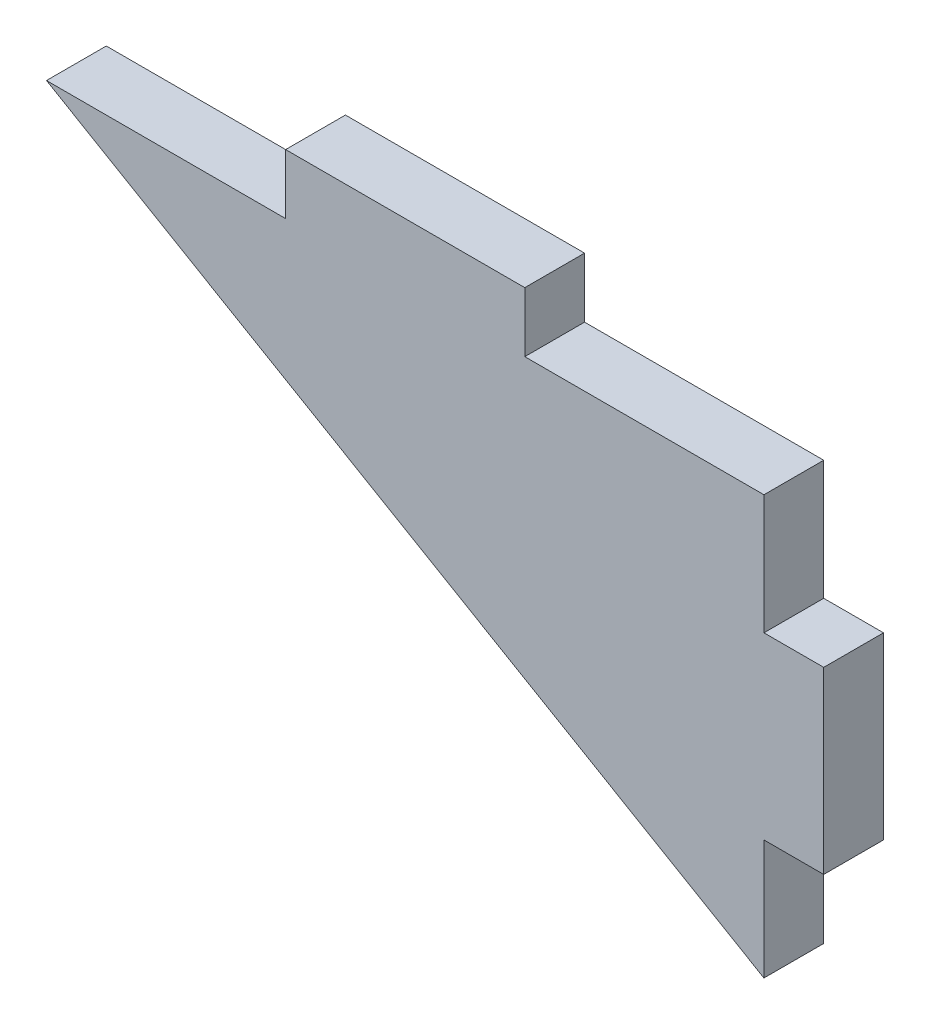
ISO-10303-21;
HEADER;
FILE_DESCRIPTION(('STEP AP214'),'2;1');
FILE_NAME('part.step','',(''),(''),'','','');
FILE_SCHEMA(('AUTOMOTIVE_DESIGN { 1 0 10303 214 1 1 1 1 }'));
ENDSEC;
DATA;
#1=APPLICATION_CONTEXT('core data for automotive mechanical design processes');
#2=APPLICATION_PROTOCOL_DEFINITION('international standard','automotive_design',2000,#1);
#3=PRODUCT_CONTEXT('',#1,'mechanical');
#4=PRODUCT('Part','Part','',(#3));
#5=PRODUCT_RELATED_PRODUCT_CATEGORY('part','',(#4));
#6=PRODUCT_DEFINITION_FORMATION('','',#4);
#7=PRODUCT_DEFINITION_CONTEXT('part definition',#1,'design');
#8=PRODUCT_DEFINITION('design','',#6,#7);
#9=PRODUCT_DEFINITION_SHAPE('','',#8);
#10=(LENGTH_UNIT() NAMED_UNIT(*) SI_UNIT(.MILLI.,.METRE.));
#11=(NAMED_UNIT(*) PLANE_ANGLE_UNIT() SI_UNIT($,.RADIAN.));
#12=(NAMED_UNIT(*) SI_UNIT($,.STERADIAN.) SOLID_ANGLE_UNIT());
#13=UNCERTAINTY_MEASURE_WITH_UNIT(LENGTH_MEASURE(1.E-05),#10,'distance_accuracy_value','');
#14=(GEOMETRIC_REPRESENTATION_CONTEXT(3) GLOBAL_UNCERTAINTY_ASSIGNED_CONTEXT((#13)) GLOBAL_UNIT_ASSIGNED_CONTEXT((#10,
#11,#12)) REPRESENTATION_CONTEXT('',''));
#15=CARTESIAN_POINT('',(0.,0.,0.));
#16=DIRECTION('',(0.,0.,1.));
#17=DIRECTION('',(1.,0.,0.));
#18=AXIS2_PLACEMENT_3D('',#15,#16,#17);
#19=CARTESIAN_POINT('',(-60.,35.,5.));
#20=DIRECTION('',(0.503871025524086,0.863778900898433,0.));
#21=DIRECTION('',(-0.863778900898433,0.503871025524086,0.));
#22=AXIS2_PLACEMENT_3D('',#19,#20,#21);
#23=PLANE('',#22);
#24=DIRECTION('',(0.863778900898433,-0.503871025524086,0.));
#25=VECTOR('',#24,1.);
#26=CARTESIAN_POINT('',(-60.,35.,0.));
#27=LINE('',#26,#25);
#28=CARTESIAN_POINT('',(-60.,35.,0.));
#29=VERTEX_POINT('',#28);
#30=CARTESIAN_POINT('',(0.,0.,0.));
#31=VERTEX_POINT('',#30);
#32=EDGE_CURVE('E151',#29,#31,#27,.T.);
#33=ORIENTED_EDGE('',*,*,#32,.T.);
#34=DIRECTION('',(0.,0.,-1.));
#35=VECTOR('',#34,1.);
#36=CARTESIAN_POINT('',(0.,0.,5.));
#37=LINE('',#36,#35);
#38=CARTESIAN_POINT('',(0.,0.,5.));
#39=VERTEX_POINT('',#38);
#40=EDGE_CURVE('E11',#39,#31,#37,.T.);
#41=ORIENTED_EDGE('',*,*,#40,.F.);
#42=DIRECTION('',(0.863778900898433,-0.503871025524086,0.));
#43=VECTOR('',#42,1.);
#44=CARTESIAN_POINT('',(-60.,35.,5.));
#45=LINE('',#44,#43);
#46=CARTESIAN_POINT('',(-60.,35.,5.));
#47=VERTEX_POINT('',#46);
#48=EDGE_CURVE('E171',#47,#39,#45,.T.);
#49=ORIENTED_EDGE('',*,*,#48,.F.);
#50=DIRECTION('',(0.,0.,-1.));
#51=VECTOR('',#50,1.);
#52=CARTESIAN_POINT('',(-60.,35.,5.));
#53=LINE('',#52,#51);
#54=EDGE_CURVE('E147',#47,#29,#53,.T.);
#55=ORIENTED_EDGE('',*,*,#54,.T.);
#56=EDGE_LOOP('',(#33,#41,#49,#55));
#57=FACE_BOUND('',#56,.T.);
#58=ADVANCED_FACE('F37',(#57),#23,.F.);
#59=CARTESIAN_POINT('',(0.,0.,5.));
#60=DIRECTION('',(-1.,0.,0.));
#61=DIRECTION('',(0.,0.,1.));
#62=AXIS2_PLACEMENT_3D('',#59,#60,#61);
#63=PLANE('',#62);
#64=DIRECTION('',(0.,1.,0.));
#65=VECTOR('',#64,1.);
#66=CARTESIAN_POINT('',(0.,0.,0.));
#67=LINE('',#66,#65);
#68=CARTESIAN_POINT('',(0.,10.,0.));
#69=VERTEX_POINT('',#68);
#70=EDGE_CURVE('E154',#31,#69,#67,.T.);
#71=ORIENTED_EDGE('',*,*,#70,.T.);
#72=DIRECTION('',(0.,0.,-1.));
#73=VECTOR('',#72,1.);
#74=CARTESIAN_POINT('',(0.,10.,5.));
#75=LINE('',#74,#73);
#76=CARTESIAN_POINT('',(0.,10.,5.));
#77=VERTEX_POINT('',#76);
#78=EDGE_CURVE('E45',#77,#69,#75,.T.);
#79=ORIENTED_EDGE('',*,*,#78,.F.);
#80=DIRECTION('',(0.,1.,0.));
#81=VECTOR('',#80,1.);
#82=CARTESIAN_POINT('',(0.,0.,5.));
#83=LINE('',#82,#81);
#84=EDGE_CURVE('E105',#39,#77,#83,.T.);
#85=ORIENTED_EDGE('',*,*,#84,.F.);
#86=ORIENTED_EDGE('',*,*,#40,.T.);
#87=EDGE_LOOP('',(#71,#79,#85,#86));
#88=FACE_BOUND('',#87,.T.);
#89=ADVANCED_FACE('F243',(#88),#63,.F.);
#90=CARTESIAN_POINT('',(0.,10.,5.));
#91=DIRECTION('',(0.,1.,0.));
#92=DIRECTION('',(0.,0.,1.));
#93=AXIS2_PLACEMENT_3D('',#90,#91,#92);
#94=PLANE('',#93);
#95=DIRECTION('',(1.,0.,0.));
#96=VECTOR('',#95,1.);
#97=CARTESIAN_POINT('',(0.,10.,0.));
#98=LINE('',#97,#96);
#99=CARTESIAN_POINT('',(5.,10.,0.));
#100=VERTEX_POINT('',#99);
#101=EDGE_CURVE('E156',#69,#100,#98,.T.);
#102=ORIENTED_EDGE('',*,*,#101,.T.);
#103=DIRECTION('',(0.,0.,-1.));
#104=VECTOR('',#103,1.);
#105=CARTESIAN_POINT('',(5.,10.,5.));
#106=LINE('',#105,#104);
#107=CARTESIAN_POINT('',(5.,10.,5.));
#108=VERTEX_POINT('',#107);
#109=EDGE_CURVE('E187',#108,#100,#106,.T.);
#110=ORIENTED_EDGE('',*,*,#109,.F.);
#111=DIRECTION('',(1.,0.,0.));
#112=VECTOR('',#111,1.);
#113=CARTESIAN_POINT('',(0.,10.,5.));
#114=LINE('',#113,#112);
#115=EDGE_CURVE('E195',#77,#108,#114,.T.);
#116=ORIENTED_EDGE('',*,*,#115,.F.);
#117=ORIENTED_EDGE('',*,*,#78,.T.);
#118=EDGE_LOOP('',(#102,#110,#116,#117));
#119=FACE_BOUND('',#118,.T.);
#120=ADVANCED_FACE('F193',(#119),#94,.F.);
#121=CARTESIAN_POINT('',(5.,10.,5.));
#122=DIRECTION('',(-1.,0.,0.));
#123=DIRECTION('',(0.,0.,1.));
#124=AXIS2_PLACEMENT_3D('',#121,#122,#123);
#125=PLANE('',#124);
#126=DIRECTION('',(0.,1.,0.));
#127=VECTOR('',#126,1.);
#128=CARTESIAN_POINT('',(5.,10.,0.));
#129=LINE('',#128,#127);
#130=CARTESIAN_POINT('',(5.,25.,0.));
#131=VERTEX_POINT('',#130);
#132=EDGE_CURVE('E158',#100,#131,#129,.T.);
#133=ORIENTED_EDGE('',*,*,#132,.T.);
#134=DIRECTION('',(0.,0.,-1.));
#135=VECTOR('',#134,1.);
#136=CARTESIAN_POINT('',(5.,25.,5.));
#137=LINE('',#136,#135);
#138=CARTESIAN_POINT('',(5.,25.,5.));
#139=VERTEX_POINT('',#138);
#140=EDGE_CURVE('E184',#139,#131,#137,.T.);
#141=ORIENTED_EDGE('',*,*,#140,.F.);
#142=DIRECTION('',(0.,1.,0.));
#143=VECTOR('',#142,1.);
#144=CARTESIAN_POINT('',(5.,10.,5.));
#145=LINE('',#144,#143);
#146=EDGE_CURVE('E213',#108,#139,#145,.T.);
#147=ORIENTED_EDGE('',*,*,#146,.F.);
#148=ORIENTED_EDGE('',*,*,#109,.T.);
#149=EDGE_LOOP('',(#133,#141,#147,#148));
#150=FACE_BOUND('',#149,.T.);
#151=ADVANCED_FACE('F204',(#150),#125,.F.);
#152=CARTESIAN_POINT('',(5.,25.,5.));
#153=DIRECTION('',(0.,-1.,0.));
#154=DIRECTION('',(0.,0.,-1.));
#155=AXIS2_PLACEMENT_3D('',#152,#153,#154);
#156=PLANE('',#155);
#157=DIRECTION('',(-1.,0.,0.));
#158=VECTOR('',#157,1.);
#159=CARTESIAN_POINT('',(5.,25.,0.));
#160=LINE('',#159,#158);
#161=CARTESIAN_POINT('',(0.,25.,0.));
#162=VERTEX_POINT('',#161);
#163=EDGE_CURVE('E160',#131,#162,#160,.T.);
#164=ORIENTED_EDGE('',*,*,#163,.T.);
#165=DIRECTION('',(0.,0.,-1.));
#166=VECTOR('',#165,1.);
#167=CARTESIAN_POINT('',(0.,25.,5.));
#168=LINE('',#167,#166);
#169=CARTESIAN_POINT('',(0.,25.,5.));
#170=VERTEX_POINT('',#169);
#171=EDGE_CURVE('E181',#170,#162,#168,.T.);
#172=ORIENTED_EDGE('',*,*,#171,.F.);
#173=DIRECTION('',(-1.,0.,0.));
#174=VECTOR('',#173,1.);
#175=CARTESIAN_POINT('',(5.,25.,5.));
#176=LINE('',#175,#174);
#177=EDGE_CURVE('E210',#139,#170,#176,.T.);
#178=ORIENTED_EDGE('',*,*,#177,.F.);
#179=ORIENTED_EDGE('',*,*,#140,.T.);
#180=EDGE_LOOP('',(#164,#172,#178,#179));
#181=FACE_BOUND('',#180,.T.);
#182=ADVANCED_FACE('F208',(#181),#156,.F.);
#183=CARTESIAN_POINT('',(0.,25.,5.));
#184=DIRECTION('',(-1.,0.,0.));
#185=DIRECTION('',(0.,0.,1.));
#186=AXIS2_PLACEMENT_3D('',#183,#184,#185);
#187=PLANE('',#186);
#188=DIRECTION('',(0.,1.,0.));
#189=VECTOR('',#188,1.);
#190=CARTESIAN_POINT('',(0.,25.,0.));
#191=LINE('',#190,#189);
#192=CARTESIAN_POINT('',(0.,35.,0.));
#193=VERTEX_POINT('',#192);
#194=EDGE_CURVE('E162',#162,#193,#191,.T.);
#195=ORIENTED_EDGE('',*,*,#194,.T.);
#196=DIRECTION('',(0.,0.,-1.));
#197=VECTOR('',#196,1.);
#198=CARTESIAN_POINT('',(0.,35.,5.));
#199=LINE('',#198,#197);
#200=CARTESIAN_POINT('',(0.,35.,5.));
#201=VERTEX_POINT('',#200);
#202=EDGE_CURVE('E178',#201,#193,#199,.T.);
#203=ORIENTED_EDGE('',*,*,#202,.F.);
#204=DIRECTION('',(0.,1.,0.));
#205=VECTOR('',#204,1.);
#206=CARTESIAN_POINT('',(0.,25.,5.));
#207=LINE('',#206,#205);
#208=EDGE_CURVE('E212',#170,#201,#207,.T.);
#209=ORIENTED_EDGE('',*,*,#208,.F.);
#210=ORIENTED_EDGE('',*,*,#171,.T.);
#211=EDGE_LOOP('',(#195,#203,#209,#210));
#212=FACE_BOUND('',#211,.T.);
#213=ADVANCED_FACE('F256',(#212),#187,.F.);
#214=CARTESIAN_POINT('',(0.,35.,5.));
#215=DIRECTION('',(0.,-1.,0.));
#216=DIRECTION('',(0.,0.,-1.));
#217=AXIS2_PLACEMENT_3D('',#214,#215,#216);
#218=PLANE('',#217);
#219=DIRECTION('',(-1.,0.,0.));
#220=VECTOR('',#219,1.);
#221=CARTESIAN_POINT('',(0.,35.,0.));
#222=LINE('',#221,#220);
#223=CARTESIAN_POINT('',(-20.,35.,0.));
#224=VERTEX_POINT('',#223);
#225=EDGE_CURVE('E164',#193,#224,#222,.T.);
#226=ORIENTED_EDGE('',*,*,#225,.T.);
#227=DIRECTION('',(0.,0.,-1.));
#228=VECTOR('',#227,1.);
#229=CARTESIAN_POINT('',(-20.,35.,5.));
#230=LINE('',#229,#228);
#231=CARTESIAN_POINT('',(-20.,35.,5.));
#232=VERTEX_POINT('',#231);
#233=EDGE_CURVE('E175',#232,#224,#230,.T.);
#234=ORIENTED_EDGE('',*,*,#233,.F.);
#235=DIRECTION('',(-1.,0.,0.));
#236=VECTOR('',#235,1.);
#237=CARTESIAN_POINT('',(0.,35.,5.));
#238=LINE('',#237,#236);
#239=EDGE_CURVE('E215',#201,#232,#238,.T.);
#240=ORIENTED_EDGE('',*,*,#239,.F.);
#241=ORIENTED_EDGE('',*,*,#202,.T.);
#242=EDGE_LOOP('',(#226,#234,#240,#241));
#243=FACE_BOUND('',#242,.T.);
#244=ADVANCED_FACE('F224',(#243),#218,.F.);
#245=CARTESIAN_POINT('',(-20.,35.,5.));
#246=DIRECTION('',(-1.,0.,0.));
#247=DIRECTION('',(0.,0.,1.));
#248=AXIS2_PLACEMENT_3D('',#245,#246,#247);
#249=PLANE('',#248);
#250=DIRECTION('',(0.,1.,0.));
#251=VECTOR('',#250,1.);
#252=CARTESIAN_POINT('',(-20.,35.,0.));
#253=LINE('',#252,#251);
#254=CARTESIAN_POINT('',(-20.,40.,0.));
#255=VERTEX_POINT('',#254);
#256=EDGE_CURVE('E166',#224,#255,#253,.T.);
#257=ORIENTED_EDGE('',*,*,#256,.T.);
#258=DIRECTION('',(0.,0.,-1.));
#259=VECTOR('',#258,1.);
#260=CARTESIAN_POINT('',(-20.,40.,5.));
#261=LINE('',#260,#259);
#262=CARTESIAN_POINT('',(-20.,40.,5.));
#263=VERTEX_POINT('',#262);
#264=EDGE_CURVE('E142',#263,#255,#261,.T.);
#265=ORIENTED_EDGE('',*,*,#264,.F.);
#266=DIRECTION('',(0.,1.,0.));
#267=VECTOR('',#266,1.);
#268=CARTESIAN_POINT('',(-20.,35.,5.));
#269=LINE('',#268,#267);
#270=EDGE_CURVE('E133',#232,#263,#269,.T.);
#271=ORIENTED_EDGE('',*,*,#270,.F.);
#272=ORIENTED_EDGE('',*,*,#233,.T.);
#273=EDGE_LOOP('',(#257,#265,#271,#272));
#274=FACE_BOUND('',#273,.T.);
#275=ADVANCED_FACE('F228',(#274),#249,.F.);
#276=CARTESIAN_POINT('',(-20.,40.,5.));
#277=DIRECTION('',(0.,-1.,0.));
#278=DIRECTION('',(0.,0.,-1.));
#279=AXIS2_PLACEMENT_3D('',#276,#277,#278);
#280=PLANE('',#279);
#281=DIRECTION('',(-1.,0.,0.));
#282=VECTOR('',#281,1.);
#283=CARTESIAN_POINT('',(-20.,40.,0.));
#284=LINE('',#283,#282);
#285=CARTESIAN_POINT('',(-40.,40.,0.));
#286=VERTEX_POINT('',#285);
#287=EDGE_CURVE('E141',#255,#286,#284,.T.);
#288=ORIENTED_EDGE('',*,*,#287,.T.);
#289=DIRECTION('',(0.,0.,-1.));
#290=VECTOR('',#289,1.);
#291=CARTESIAN_POINT('',(-40.,40.,5.));
#292=LINE('',#291,#290);
#293=CARTESIAN_POINT('',(-40.,40.,5.));
#294=VERTEX_POINT('',#293);
#295=EDGE_CURVE('E138',#294,#286,#292,.T.);
#296=ORIENTED_EDGE('',*,*,#295,.F.);
#297=DIRECTION('',(-1.,0.,0.));
#298=VECTOR('',#297,1.);
#299=CARTESIAN_POINT('',(-20.,40.,5.));
#300=LINE('',#299,#298);
#301=EDGE_CURVE('E127',#263,#294,#300,.T.);
#302=ORIENTED_EDGE('',*,*,#301,.F.);
#303=ORIENTED_EDGE('',*,*,#264,.T.);
#304=EDGE_LOOP('',(#288,#296,#302,#303));
#305=FACE_BOUND('',#304,.T.);
#306=ADVANCED_FACE('F139',(#305),#280,.F.);
#307=CARTESIAN_POINT('',(-40.,40.,5.));
#308=DIRECTION('',(1.,0.,0.));
#309=DIRECTION('',(0.,0.,-1.));
#310=AXIS2_PLACEMENT_3D('',#307,#308,#309);
#311=PLANE('',#310);
#312=DIRECTION('',(0.,-1.,0.));
#313=VECTOR('',#312,1.);
#314=CARTESIAN_POINT('',(-40.,40.,0.));
#315=LINE('',#314,#313);
#316=CARTESIAN_POINT('',(-40.,35.,0.));
#317=VERTEX_POINT('',#316);
#318=EDGE_CURVE('E91',#286,#317,#315,.T.);
#319=ORIENTED_EDGE('',*,*,#318,.T.);
#320=DIRECTION('',(0.,0.,-1.));
#321=VECTOR('',#320,1.);
#322=CARTESIAN_POINT('',(-40.,35.,5.));
#323=LINE('',#322,#321);
#324=CARTESIAN_POINT('',(-40.,35.,5.));
#325=VERTEX_POINT('',#324);
#326=EDGE_CURVE('E143',#325,#317,#323,.T.);
#327=ORIENTED_EDGE('',*,*,#326,.F.);
#328=DIRECTION('',(0.,-1.,0.));
#329=VECTOR('',#328,1.);
#330=CARTESIAN_POINT('',(-40.,40.,5.));
#331=LINE('',#330,#329);
#332=EDGE_CURVE('E131',#294,#325,#331,.T.);
#333=ORIENTED_EDGE('',*,*,#332,.F.);
#334=ORIENTED_EDGE('',*,*,#295,.T.);
#335=EDGE_LOOP('',(#319,#327,#333,#334));
#336=FACE_BOUND('',#335,.T.);
#337=ADVANCED_FACE('F145',(#336),#311,.F.);
#338=CARTESIAN_POINT('',(-40.,35.,5.));
#339=DIRECTION('',(0.,-1.,0.));
#340=DIRECTION('',(0.,0.,-1.));
#341=AXIS2_PLACEMENT_3D('',#338,#339,#340);
#342=PLANE('',#341);
#343=DIRECTION('',(-1.,0.,0.));
#344=VECTOR('',#343,1.);
#345=CARTESIAN_POINT('',(-40.,35.,0.));
#346=LINE('',#345,#344);
#347=EDGE_CURVE('E97',#317,#29,#346,.T.);
#348=ORIENTED_EDGE('',*,*,#347,.T.);
#349=ORIENTED_EDGE('',*,*,#54,.F.);
#350=DIRECTION('',(-1.,0.,0.));
#351=VECTOR('',#350,1.);
#352=CARTESIAN_POINT('',(-40.,35.,5.));
#353=LINE('',#352,#351);
#354=EDGE_CURVE('E53',#325,#47,#353,.T.);
#355=ORIENTED_EDGE('',*,*,#354,.F.);
#356=ORIENTED_EDGE('',*,*,#326,.T.);
#357=EDGE_LOOP('',(#348,#349,#355,#356));
#358=FACE_BOUND('',#357,.T.);
#359=ADVANCED_FACE('F232',(#358),#342,.F.);
#360=CARTESIAN_POINT('',(0.,0.,5.));
#361=DIRECTION('',(0.,0.,1.));
#362=DIRECTION('',(1.,0.,0.));
#363=AXIS2_PLACEMENT_3D('',#360,#361,#362);
#364=PLANE('',#363);
#365=ORIENTED_EDGE('',*,*,#48,.T.);
#366=ORIENTED_EDGE('',*,*,#84,.T.);
#367=ORIENTED_EDGE('',*,*,#115,.T.);
#368=ORIENTED_EDGE('',*,*,#146,.T.);
#369=ORIENTED_EDGE('',*,*,#177,.T.);
#370=ORIENTED_EDGE('',*,*,#208,.T.);
#371=ORIENTED_EDGE('',*,*,#239,.T.);
#372=ORIENTED_EDGE('',*,*,#270,.T.);
#373=ORIENTED_EDGE('',*,*,#301,.T.);
#374=ORIENTED_EDGE('',*,*,#332,.T.);
#375=ORIENTED_EDGE('',*,*,#354,.T.);
#376=EDGE_LOOP('',(#365,#366,#367,#368,#369,#370,#371,#372,#373,#374,#375));
#377=FACE_BOUND('',#376,.T.);
#378=ADVANCED_FACE('F129',(#377),#364,.T.);
#379=CARTESIAN_POINT('',(0.,0.,0.));
#380=DIRECTION('',(0.,0.,1.));
#381=DIRECTION('',(1.,0.,0.));
#382=AXIS2_PLACEMENT_3D('',#379,#380,#381);
#383=PLANE('',#382);
#384=ORIENTED_EDGE('',*,*,#32,.F.);
#385=ORIENTED_EDGE('',*,*,#347,.F.);
#386=ORIENTED_EDGE('',*,*,#318,.F.);
#387=ORIENTED_EDGE('',*,*,#287,.F.);
#388=ORIENTED_EDGE('',*,*,#256,.F.);
#389=ORIENTED_EDGE('',*,*,#225,.F.);
#390=ORIENTED_EDGE('',*,*,#194,.F.);
#391=ORIENTED_EDGE('',*,*,#163,.F.);
#392=ORIENTED_EDGE('',*,*,#132,.F.);
#393=ORIENTED_EDGE('',*,*,#101,.F.);
#394=ORIENTED_EDGE('',*,*,#70,.F.);
#395=EDGE_LOOP('',(#384,#385,#386,#387,#388,#389,#390,#391,#392,#393,#394));
#396=FACE_BOUND('',#395,.T.);
#397=ADVANCED_FACE('F199',(#396),#383,.F.);
#398=CLOSED_SHELL('',(#58,#89,#120,#151,#182,#213,#244,#275,#306,#337,#359,#378,#397));
#399=MANIFOLD_SOLID_BREP('B2',#398);
#400=ADVANCED_BREP_SHAPE_REPRESENTATION('',(#18,#399),#14);
#401=SHAPE_DEFINITION_REPRESENTATION(#9,#400);
ENDSEC;
END-ISO-10303-21;
